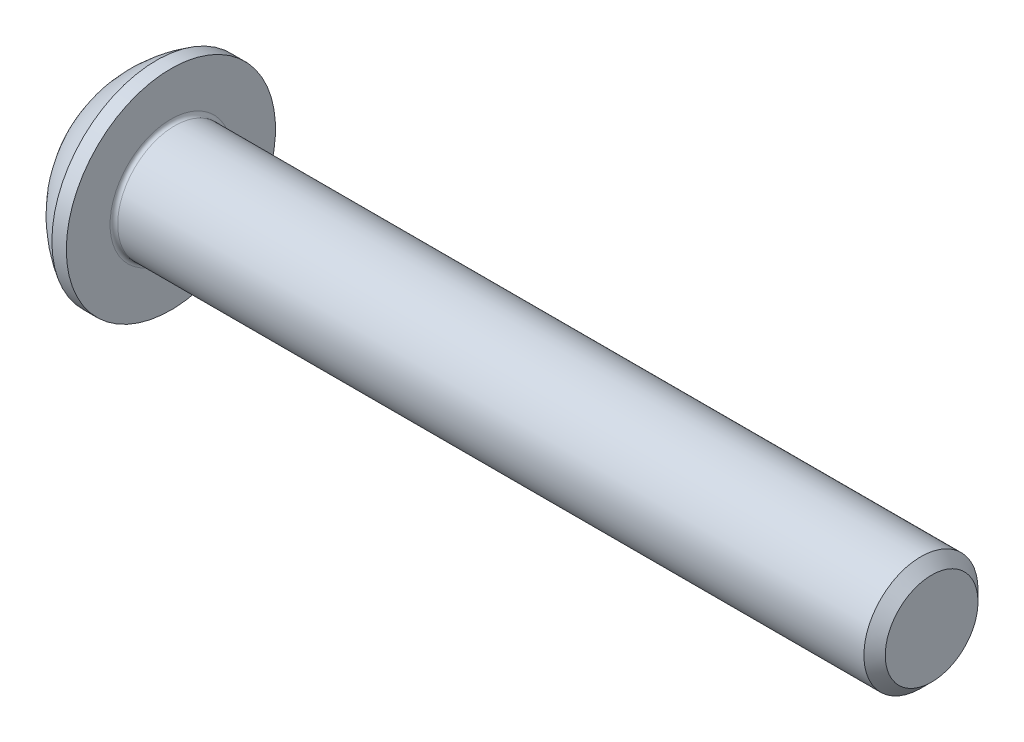
ISO-10303-21;
HEADER;
FILE_DESCRIPTION(('STEP AP214'),'2;1');
FILE_NAME('part.step','',(''),(''),'','','');
FILE_SCHEMA(('AUTOMOTIVE_DESIGN { 1 0 10303 214 1 1 1 1 }'));
ENDSEC;
DATA;
#1=APPLICATION_CONTEXT('core data for automotive mechanical design processes');
#2=APPLICATION_PROTOCOL_DEFINITION('international standard','automotive_design',2000,#1);
#3=PRODUCT_CONTEXT('',#1,'mechanical');
#4=PRODUCT('Part','Part','',(#3));
#5=PRODUCT_RELATED_PRODUCT_CATEGORY('part','',(#4));
#6=PRODUCT_DEFINITION_FORMATION('','',#4);
#7=PRODUCT_DEFINITION_CONTEXT('part definition',#1,'design');
#8=PRODUCT_DEFINITION('design','',#6,#7);
#9=PRODUCT_DEFINITION_SHAPE('','',#8);
#10=(LENGTH_UNIT() NAMED_UNIT(*) SI_UNIT(.MILLI.,.METRE.));
#11=(NAMED_UNIT(*) PLANE_ANGLE_UNIT() SI_UNIT($,.RADIAN.));
#12=(NAMED_UNIT(*) SI_UNIT($,.STERADIAN.) SOLID_ANGLE_UNIT());
#13=UNCERTAINTY_MEASURE_WITH_UNIT(LENGTH_MEASURE(1.E-05),#10,'distance_accuracy_value','');
#14=(GEOMETRIC_REPRESENTATION_CONTEXT(3) GLOBAL_UNCERTAINTY_ASSIGNED_CONTEXT((#13)) GLOBAL_UNIT_ASSIGNED_CONTEXT((#10,
#11,#12)) REPRESENTATION_CONTEXT('',''));
#15=CARTESIAN_POINT('',(0.,0.,0.));
#16=DIRECTION('',(0.,0.,1.));
#17=DIRECTION('',(1.,0.,0.));
#18=AXIS2_PLACEMENT_3D('',#15,#16,#17);
#19=CARTESIAN_POINT('',(1.04,0.,0.));
#20=DIRECTION('',(-1.,0.,0.));
#21=DIRECTION('',(0.,0.,1.));
#22=AXIS2_PLACEMENT_3D('',#19,#20,#21);
#23=PLANE('',#22);
#24=DIRECTION('',(0.,-1.,0.));
#25=VECTOR('',#24,1.);
#26=CARTESIAN_POINT('',(1.04,0.577350269189628,-1.));
#27=LINE('',#26,#25);
#28=CARTESIAN_POINT('',(1.04,0.577350269189628,-1.));
#29=VERTEX_POINT('',#28);
#30=CARTESIAN_POINT('',(1.04,0.,-1.));
#31=VERTEX_POINT('',#30);
#32=EDGE_CURVE('E254',#29,#31,#27,.T.);
#33=ORIENTED_EDGE('',*,*,#32,.T.);
#34=CARTESIAN_POINT('',(1.04,0.,0.));
#35=DIRECTION('',(1.,0.,0.));
#36=DIRECTION('',(0.,0.,-1.));
#37=AXIS2_PLACEMENT_3D('',#34,#35,#36);
#38=CIRCLE('',#37,0.999999999983859);
#39=CARTESIAN_POINT('',(1.04,0.866025403770461,-0.499999999991928));
#40=VERTEX_POINT('',#39);
#41=EDGE_CURVE('E50',#31,#40,#38,.T.);
#42=ORIENTED_EDGE('',*,*,#41,.T.);
#43=DIRECTION('',(0.,-0.499999999999999,-0.866025403784439));
#44=VECTOR('',#43,1.);
#45=CARTESIAN_POINT('',(1.04,1.15470053837925,0.));
#46=LINE('',#45,#44);
#47=EDGE_CURVE('E225',#40,#29,#46,.T.);
#48=ORIENTED_EDGE('',*,*,#47,.T.);
#49=EDGE_LOOP('',(#33,#42,#48));
#50=FACE_BOUND('',#49,.T.);
#51=ADVANCED_FACE('F35',(#50),#23,.T.);
#52=CARTESIAN_POINT('',(1.04,1.15470053837925,0.));
#53=VERTEX_POINT('',#52);
#54=EDGE_CURVE('E257',#53,#40,#46,.T.);
#55=ORIENTED_EDGE('',*,*,#54,.T.);
#56=CARTESIAN_POINT('',(1.04,0.866025403770461,0.499999999991928));
#57=VERTEX_POINT('',#56);
#58=EDGE_CURVE('E189',#40,#57,#38,.T.);
#59=ORIENTED_EDGE('',*,*,#58,.T.);
#60=DIRECTION('',(0.,0.499999999999999,-0.866025403784439));
#61=VECTOR('',#60,1.);
#62=CARTESIAN_POINT('',(1.04,0.577350269189628,1.));
#63=LINE('',#62,#61);
#64=EDGE_CURVE('E241',#57,#53,#63,.T.);
#65=ORIENTED_EDGE('',*,*,#64,.T.);
#66=EDGE_LOOP('',(#55,#59,#65));
#67=FACE_BOUND('',#66,.T.);
#68=ADVANCED_FACE('F125',(#67),#23,.T.);
#69=CARTESIAN_POINT('',(1.04,0.577350269189628,1.));
#70=VERTEX_POINT('',#69);
#71=EDGE_CURVE('E213',#70,#57,#63,.T.);
#72=ORIENTED_EDGE('',*,*,#71,.T.);
#73=CARTESIAN_POINT('',(1.04,0.,0.999999999983859));
#74=VERTEX_POINT('',#73);
#75=EDGE_CURVE('E193',#57,#74,#38,.T.);
#76=ORIENTED_EDGE('',*,*,#75,.T.);
#77=DIRECTION('',(0.,1.,0.));
#78=VECTOR('',#77,1.);
#79=CARTESIAN_POINT('',(1.04,-0.577350269189625,1.));
#80=LINE('',#79,#78);
#81=EDGE_CURVE('E245',#74,#70,#80,.T.);
#82=ORIENTED_EDGE('',*,*,#81,.T.);
#83=EDGE_LOOP('',(#72,#76,#82));
#84=FACE_BOUND('',#83,.T.);
#85=ADVANCED_FACE('F130',(#84),#23,.T.);
#86=CARTESIAN_POINT('',(1.04,-0.577350269189625,1.));
#87=VERTEX_POINT('',#86);
#88=EDGE_CURVE('E242',#87,#74,#80,.T.);
#89=ORIENTED_EDGE('',*,*,#88,.T.);
#90=CARTESIAN_POINT('',(1.04,-0.866025403770461,0.499999999991928));
#91=VERTEX_POINT('',#90);
#92=EDGE_CURVE('E263',#74,#91,#38,.T.);
#93=ORIENTED_EDGE('',*,*,#92,.T.);
#94=DIRECTION('',(0.,0.499999999999998,0.86602540378444));
#95=VECTOR('',#94,1.);
#96=CARTESIAN_POINT('',(1.04,-1.15470053837925,0.));
#97=LINE('',#96,#95);
#98=EDGE_CURVE('E249',#91,#87,#97,.T.);
#99=ORIENTED_EDGE('',*,*,#98,.T.);
#100=EDGE_LOOP('',(#89,#93,#99));
#101=FACE_BOUND('',#100,.T.);
#102=ADVANCED_FACE('F275',(#101),#23,.T.);
#103=CARTESIAN_POINT('',(1.04,-1.15470053837925,0.));
#104=VERTEX_POINT('',#103);
#105=EDGE_CURVE('E246',#104,#91,#97,.T.);
#106=ORIENTED_EDGE('',*,*,#105,.T.);
#107=CARTESIAN_POINT('',(1.04,-0.866025403770461,-0.499999999991927));
#108=VERTEX_POINT('',#107);
#109=EDGE_CURVE('E260',#91,#108,#38,.T.);
#110=ORIENTED_EDGE('',*,*,#109,.T.);
#111=DIRECTION('',(0.,-0.499999999999998,0.86602540378444));
#112=VECTOR('',#111,1.);
#113=CARTESIAN_POINT('',(1.04,-0.577350269189626,-1.));
#114=LINE('',#113,#112);
#115=EDGE_CURVE('E253',#108,#104,#114,.T.);
#116=ORIENTED_EDGE('',*,*,#115,.T.);
#117=EDGE_LOOP('',(#106,#110,#116));
#118=FACE_BOUND('',#117,.T.);
#119=ADVANCED_FACE('F123',(#118),#23,.T.);
#120=CARTESIAN_POINT('',(1.65,0.,0.));
#121=DIRECTION('',(-1.,0.,0.));
#122=DIRECTION('',(0.,0.,1.));
#123=AXIS2_PLACEMENT_3D('',#120,#121,#122);
#124=CYLINDRICAL_SURFACE('',#123,2.75);
#125=CARTESIAN_POINT('',(1.65,0.,0.));
#126=DIRECTION('',(-1.,0.,0.));
#127=DIRECTION('',(0.,0.,1.));
#128=AXIS2_PLACEMENT_3D('',#125,#126,#127);
#129=CIRCLE('',#128,2.75);
#130=CARTESIAN_POINT('',(1.65,0.,2.75));
#131=VERTEX_POINT('',#130);
#132=EDGE_CURVE('E196',#131,#131,#129,.T.);
#133=ORIENTED_EDGE('',*,*,#132,.T.);
#134=EDGE_LOOP('',(#133));
#135=FACE_BOUND('',#134,.T.);
#136=CARTESIAN_POINT('',(1.27,0.,0.));
#137=DIRECTION('',(-1.,0.,0.));
#138=DIRECTION('',(0.,0.,1.));
#139=AXIS2_PLACEMENT_3D('',#136,#137,#138);
#140=CIRCLE('',#139,2.75);
#141=CARTESIAN_POINT('',(1.27,0.,2.75));
#142=VERTEX_POINT('',#141);
#143=EDGE_CURVE('E206',#142,#142,#140,.T.);
#144=ORIENTED_EDGE('',*,*,#143,.F.);
#145=EDGE_LOOP('',(#144));
#146=FACE_BOUND('',#145,.T.);
#147=ADVANCED_FACE('F167',(#135,#146),#124,.T.);
#148=CARTESIAN_POINT('',(1.65,2.75,0.));
#149=DIRECTION('',(1.,0.,0.));
#150=DIRECTION('',(0.,0.,-1.));
#151=AXIS2_PLACEMENT_3D('',#148,#149,#150);
#152=PLANE('',#151);
#153=CARTESIAN_POINT('',(1.65,0.,0.));
#154=DIRECTION('',(1.,0.,0.));
#155=DIRECTION('',(0.,0.,-1.));
#156=AXIS2_PLACEMENT_3D('',#153,#154,#155);
#157=CIRCLE('',#156,1.6);
#158=CARTESIAN_POINT('',(1.65,0.,-1.6));
#159=VERTEX_POINT('',#158);
#160=EDGE_CURVE('E184',#159,#159,#157,.F.);
#161=ORIENTED_EDGE('',*,*,#160,.T.);
#162=EDGE_LOOP('',(#161));
#163=FACE_BOUND('',#162,.T.);
#164=ORIENTED_EDGE('',*,*,#132,.F.);
#165=EDGE_LOOP('',(#164));
#166=FACE_BOUND('',#165,.T.);
#167=ADVANCED_FACE('F163',(#163,#166),#152,.T.);
#168=CARTESIAN_POINT('',(0.,0.,0.));
#169=DIRECTION('',(-1.,0.,0.));
#170=DIRECTION('',(0.,0.,1.));
#171=AXIS2_PLACEMENT_3D('',#168,#169,#170);
#172=PLANE('',#171);
#173=DIRECTION('',(0.,-0.499999999999999,-0.866025403784439));
#174=VECTOR('',#173,1.);
#175=CARTESIAN_POINT('',(0.,1.15470053837925,0.));
#176=LINE('',#175,#174);
#177=CARTESIAN_POINT('',(0.,1.15470053837925,0.));
#178=VERTEX_POINT('',#177);
#179=CARTESIAN_POINT('',(0.,0.577350269189628,-1.));
#180=VERTEX_POINT('',#179);
#181=EDGE_CURVE('E58',#178,#180,#176,.T.);
#182=ORIENTED_EDGE('',*,*,#181,.F.);
#183=DIRECTION('',(0.,0.499999999999999,-0.866025403784439));
#184=VECTOR('',#183,1.);
#185=CARTESIAN_POINT('',(0.,0.577350269189628,1.));
#186=LINE('',#185,#184);
#187=CARTESIAN_POINT('',(0.,0.577350269189628,1.));
#188=VERTEX_POINT('',#187);
#189=EDGE_CURVE('E222',#188,#178,#186,.T.);
#190=ORIENTED_EDGE('',*,*,#189,.F.);
#191=DIRECTION('',(0.,1.,0.));
#192=VECTOR('',#191,1.);
#193=CARTESIAN_POINT('',(0.,-0.577350269189625,1.));
#194=LINE('',#193,#192);
#195=CARTESIAN_POINT('',(0.,-0.577350269189625,1.));
#196=VERTEX_POINT('',#195);
#197=EDGE_CURVE('E226',#196,#188,#194,.T.);
#198=ORIENTED_EDGE('',*,*,#197,.F.);
#199=DIRECTION('',(0.,0.499999999999998,0.86602540378444));
#200=VECTOR('',#199,1.);
#201=CARTESIAN_POINT('',(0.,-1.15470053837925,0.));
#202=LINE('',#201,#200);
#203=CARTESIAN_POINT('',(0.,-1.15470053837925,0.));
#204=VERTEX_POINT('',#203);
#205=EDGE_CURVE('E229',#204,#196,#202,.T.);
#206=ORIENTED_EDGE('',*,*,#205,.F.);
#207=DIRECTION('',(0.,-0.499999999999998,0.86602540378444));
#208=VECTOR('',#207,1.);
#209=CARTESIAN_POINT('',(0.,-0.577350269189626,-1.));
#210=LINE('',#209,#208);
#211=CARTESIAN_POINT('',(0.,-0.577350269189626,-1.));
#212=VERTEX_POINT('',#211);
#213=EDGE_CURVE('E232',#212,#204,#210,.T.);
#214=ORIENTED_EDGE('',*,*,#213,.F.);
#215=DIRECTION('',(0.,-1.,0.));
#216=VECTOR('',#215,1.);
#217=CARTESIAN_POINT('',(0.,0.577350269189628,-1.));
#218=LINE('',#217,#216);
#219=EDGE_CURVE('E235',#180,#212,#218,.T.);
#220=ORIENTED_EDGE('',*,*,#219,.F.);
#221=EDGE_LOOP('',(#182,#190,#198,#206,#214,#220));
#222=FACE_BOUND('',#221,.T.);
#223=CARTESIAN_POINT('',(0.,0.,0.));
#224=DIRECTION('',(-1.,0.,0.));
#225=DIRECTION('',(0.,0.,1.));
#226=AXIS2_PLACEMENT_3D('',#223,#224,#225);
#227=CIRCLE('',#226,1.425);
#228=CARTESIAN_POINT('',(0.,0.,1.425));
#229=VERTEX_POINT('',#228);
#230=EDGE_CURVE('E203',#229,#229,#227,.T.);
#231=ORIENTED_EDGE('',*,*,#230,.T.);
#232=EDGE_LOOP('',(#231));
#233=FACE_BOUND('',#232,.T.);
#234=ADVANCED_FACE('F159',(#222,#233),#172,.T.);
#235=CARTESIAN_POINT('',(2.96202427690375,0.,0.));
#236=DIRECTION('',(-1.,0.,0.));
#237=DIRECTION('',(0.,0.,1.));
#238=AXIS2_PLACEMENT_3D('',#235,#236,#237);
#239=DEGENERATE_TOROIDAL_SURFACE('',#238,0.14293081635303,3.35141684393879,.F.);
#240=ORIENTED_EDGE('',*,*,#143,.T.);
#241=EDGE_LOOP('',(#240));
#242=FACE_BOUND('',#241,.T.);
#243=ORIENTED_EDGE('',*,*,#230,.F.);
#244=EDGE_LOOP('',(#243));
#245=FACE_BOUND('',#244,.T.);
#246=ADVANCED_FACE('F156',(#242,#245),#239,.F.);
#247=CARTESIAN_POINT('',(1.04,1.15470053837925,0.));
#248=DIRECTION('',(0.,0.866025403784439,-0.499999999999999));
#249=DIRECTION('',(0.,0.499999999999999,0.866025403784439));
#250=AXIS2_PLACEMENT_3D('',#247,#248,#249);
#251=PLANE('',#250);
#252=ORIENTED_EDGE('',*,*,#181,.T.);
#253=DIRECTION('',(-1.,0.,0.));
#254=VECTOR('',#253,1.);
#255=CARTESIAN_POINT('',(1.04,0.577350269189628,-1.));
#256=LINE('',#255,#254);
#257=EDGE_CURVE('E210',#29,#180,#256,.T.);
#258=ORIENTED_EDGE('',*,*,#257,.F.);
#259=ORIENTED_EDGE('',*,*,#47,.F.);
#260=ORIENTED_EDGE('',*,*,#54,.F.);
#261=DIRECTION('',(-1.,0.,0.));
#262=VECTOR('',#261,1.);
#263=CARTESIAN_POINT('',(1.04,1.15470053837925,0.));
#264=LINE('',#263,#262);
#265=EDGE_CURVE('E209',#53,#178,#264,.T.);
#266=ORIENTED_EDGE('',*,*,#265,.T.);
#267=EDGE_LOOP('',(#252,#258,#259,#260,#266));
#268=FACE_BOUND('',#267,.T.);
#269=ADVANCED_FACE('F138',(#268),#251,.F.);
#270=CARTESIAN_POINT('',(1.04,0.577350269189628,1.));
#271=DIRECTION('',(0.,0.866025403784439,0.499999999999999));
#272=DIRECTION('',(0.,-0.499999999999999,0.866025403784439));
#273=AXIS2_PLACEMENT_3D('',#270,#271,#272);
#274=PLANE('',#273);
#275=ORIENTED_EDGE('',*,*,#189,.T.);
#276=ORIENTED_EDGE('',*,*,#265,.F.);
#277=ORIENTED_EDGE('',*,*,#64,.F.);
#278=ORIENTED_EDGE('',*,*,#71,.F.);
#279=DIRECTION('',(-1.,0.,0.));
#280=VECTOR('',#279,1.);
#281=CARTESIAN_POINT('',(1.04,0.577350269189628,1.));
#282=LINE('',#281,#280);
#283=EDGE_CURVE('E219',#70,#188,#282,.T.);
#284=ORIENTED_EDGE('',*,*,#283,.T.);
#285=EDGE_LOOP('',(#275,#276,#277,#278,#284));
#286=FACE_BOUND('',#285,.T.);
#287=ADVANCED_FACE('F134',(#286),#274,.F.);
#288=CARTESIAN_POINT('',(1.04,-0.577350269189625,1.));
#289=DIRECTION('',(0.,0.,1.));
#290=DIRECTION('',(1.,0.,0.));
#291=AXIS2_PLACEMENT_3D('',#288,#289,#290);
#292=PLANE('',#291);
#293=ORIENTED_EDGE('',*,*,#197,.T.);
#294=ORIENTED_EDGE('',*,*,#283,.F.);
#295=ORIENTED_EDGE('',*,*,#81,.F.);
#296=ORIENTED_EDGE('',*,*,#88,.F.);
#297=DIRECTION('',(-1.,0.,0.));
#298=VECTOR('',#297,1.);
#299=CARTESIAN_POINT('',(1.04,-0.577350269189625,1.));
#300=LINE('',#299,#298);
#301=EDGE_CURVE('E217',#87,#196,#300,.T.);
#302=ORIENTED_EDGE('',*,*,#301,.T.);
#303=EDGE_LOOP('',(#293,#294,#295,#296,#302));
#304=FACE_BOUND('',#303,.T.);
#305=ADVANCED_FACE('F137',(#304),#292,.F.);
#306=CARTESIAN_POINT('',(1.04,-1.15470053837925,0.));
#307=DIRECTION('',(0.,-0.86602540378444,0.499999999999998));
#308=DIRECTION('',(0.,-0.499999999999998,-0.86602540378444));
#309=AXIS2_PLACEMENT_3D('',#306,#307,#308);
#310=PLANE('',#309);
#311=ORIENTED_EDGE('',*,*,#205,.T.);
#312=ORIENTED_EDGE('',*,*,#301,.F.);
#313=ORIENTED_EDGE('',*,*,#98,.F.);
#314=ORIENTED_EDGE('',*,*,#105,.F.);
#315=DIRECTION('',(-1.,0.,0.));
#316=VECTOR('',#315,1.);
#317=CARTESIAN_POINT('',(1.04,-1.15470053837925,0.));
#318=LINE('',#317,#316);
#319=EDGE_CURVE('E215',#104,#204,#318,.T.);
#320=ORIENTED_EDGE('',*,*,#319,.T.);
#321=EDGE_LOOP('',(#311,#312,#313,#314,#320));
#322=FACE_BOUND('',#321,.T.);
#323=ADVANCED_FACE('F142',(#322),#310,.F.);
#324=CARTESIAN_POINT('',(1.04,-0.577350269189626,-1.));
#325=DIRECTION('',(0.,-0.86602540378444,-0.499999999999998));
#326=DIRECTION('',(0.,0.499999999999998,-0.86602540378444));
#327=AXIS2_PLACEMENT_3D('',#324,#325,#326);
#328=PLANE('',#327);
#329=ORIENTED_EDGE('',*,*,#213,.T.);
#330=ORIENTED_EDGE('',*,*,#319,.F.);
#331=ORIENTED_EDGE('',*,*,#115,.F.);
#332=CARTESIAN_POINT('',(1.04,-0.577350269189626,-1.));
#333=VERTEX_POINT('',#332);
#334=EDGE_CURVE('E250',#333,#108,#114,.T.);
#335=ORIENTED_EDGE('',*,*,#334,.F.);
#336=DIRECTION('',(-1.,0.,0.));
#337=VECTOR('',#336,1.);
#338=CARTESIAN_POINT('',(1.04,-0.577350269189626,-1.));
#339=LINE('',#338,#337);
#340=EDGE_CURVE('E212',#333,#212,#339,.T.);
#341=ORIENTED_EDGE('',*,*,#340,.T.);
#342=EDGE_LOOP('',(#329,#330,#331,#335,#341));
#343=FACE_BOUND('',#342,.T.);
#344=ADVANCED_FACE('F146',(#343),#328,.F.);
#345=CARTESIAN_POINT('',(1.04,0.577350269189628,-1.));
#346=DIRECTION('',(0.,0.,-1.));
#347=DIRECTION('',(-1.,0.,0.));
#348=AXIS2_PLACEMENT_3D('',#345,#346,#347);
#349=PLANE('',#348);
#350=ORIENTED_EDGE('',*,*,#219,.T.);
#351=ORIENTED_EDGE('',*,*,#340,.F.);
#352=EDGE_CURVE('E256',#31,#333,#27,.T.);
#353=ORIENTED_EDGE('',*,*,#352,.F.);
#354=ORIENTED_EDGE('',*,*,#32,.F.);
#355=ORIENTED_EDGE('',*,*,#257,.T.);
#356=EDGE_LOOP('',(#350,#351,#353,#354,#355));
#357=FACE_BOUND('',#356,.T.);
#358=ADVANCED_FACE('F120',(#357),#349,.F.);
#359=ORIENTED_EDGE('',*,*,#334,.T.);
#360=EDGE_CURVE('E202',#108,#31,#38,.T.);
#361=ORIENTED_EDGE('',*,*,#360,.T.);
#362=ORIENTED_EDGE('',*,*,#352,.T.);
#363=EDGE_LOOP('',(#359,#361,#362));
#364=FACE_BOUND('',#363,.T.);
#365=ADVANCED_FACE('F111',(#364),#23,.T.);
#366=CARTESIAN_POINT('',(1.61735026918031,0.,0.));
#367=DIRECTION('',(-1.,0.,0.));
#368=DIRECTION('',(0.,0.,1.));
#369=AXIS2_PLACEMENT_3D('',#366,#367,#368);
#370=CONICAL_SURFACE('',#369,0.,1.0471975511966);
#371=ORIENTED_EDGE('',*,*,#41,.F.);
#372=ORIENTED_EDGE('',*,*,#360,.F.);
#373=ORIENTED_EDGE('',*,*,#109,.F.);
#374=ORIENTED_EDGE('',*,*,#92,.F.);
#375=ORIENTED_EDGE('',*,*,#75,.F.);
#376=ORIENTED_EDGE('',*,*,#58,.F.);
#377=EDGE_LOOP('',(#371,#372,#373,#374,#375,#376));
#378=FACE_BOUND('',#377,.T.);
#379=CARTESIAN_POINT('',(1.61735026918031,0.,0.));
#380=VERTEX_POINT('',#379);
#381=VERTEX_LOOP('',#380);
#382=FACE_BOUND('',#381,.T.);
#383=ADVANCED_FACE('F108',(#378,#382),#370,.F.);
#384=CARTESIAN_POINT('',(21.65,0.,0.));
#385=DIRECTION('',(-1.,0.,0.));
#386=DIRECTION('',(0.,0.,1.));
#387=AXIS2_PLACEMENT_3D('',#384,#385,#386);
#388=CYLINDRICAL_SURFACE('',#387,1.5);
#389=CARTESIAN_POINT('',(21.3695,0.,0.));
#390=DIRECTION('',(1.,0.,0.));
#391=DIRECTION('',(0.,0.,-1.));
#392=AXIS2_PLACEMENT_3D('',#389,#390,#391);
#393=CIRCLE('',#392,1.5);
#394=CARTESIAN_POINT('',(21.3695,0.,-1.5));
#395=VERTEX_POINT('',#394);
#396=EDGE_CURVE('E11',#395,#395,#393,.F.);
#397=ORIENTED_EDGE('',*,*,#396,.T.);
#398=EDGE_LOOP('',(#397));
#399=FACE_BOUND('',#398,.T.);
#400=CARTESIAN_POINT('',(1.75,0.,0.));
#401=DIRECTION('',(1.,0.,0.));
#402=DIRECTION('',(0.,0.,-1.));
#403=AXIS2_PLACEMENT_3D('',#400,#401,#402);
#404=CIRCLE('',#403,1.5);
#405=CARTESIAN_POINT('',(1.75,0.,-1.5));
#406=VERTEX_POINT('',#405);
#407=EDGE_CURVE('E187',#406,#406,#404,.T.);
#408=ORIENTED_EDGE('',*,*,#407,.T.);
#409=EDGE_LOOP('',(#408));
#410=FACE_BOUND('',#409,.T.);
#411=ADVANCED_FACE('F110',(#399,#410),#388,.T.);
#412=CARTESIAN_POINT('',(21.65,0.,0.));
#413=DIRECTION('',(1.,0.,0.));
#414=DIRECTION('',(0.,0.,-1.));
#415=AXIS2_PLACEMENT_3D('',#412,#413,#414);
#416=PLANE('',#415);
#417=CARTESIAN_POINT('',(21.65,0.,0.));
#418=DIRECTION('',(1.,0.,0.));
#419=DIRECTION('',(0.,0.,-1.));
#420=AXIS2_PLACEMENT_3D('',#417,#418,#419);
#421=CIRCLE('',#420,1.2195);
#422=CARTESIAN_POINT('',(21.65,0.,-1.2195));
#423=VERTEX_POINT('',#422);
#424=EDGE_CURVE('E43',#423,#423,#421,.T.);
#425=ORIENTED_EDGE('',*,*,#424,.T.);
#426=EDGE_LOOP('',(#425));
#427=FACE_BOUND('',#426,.T.);
#428=ADVANCED_FACE('F117',(#427),#416,.T.);
#429=CARTESIAN_POINT('',(1.75,0.,0.));
#430=DIRECTION('',(1.,0.,0.));
#431=DIRECTION('',(0.,0.,-1.));
#432=AXIS2_PLACEMENT_3D('',#429,#430,#431);
#433=TOROIDAL_SURFACE('',#432,1.6,0.1);
#434=ORIENTED_EDGE('',*,*,#160,.F.);
#435=EDGE_LOOP('',(#434));
#436=FACE_BOUND('',#435,.T.);
#437=ORIENTED_EDGE('',*,*,#407,.F.);
#438=EDGE_LOOP('',(#437));
#439=FACE_BOUND('',#438,.T.);
#440=ADVANCED_FACE('F171',(#436,#439),#433,.F.);
#441=CARTESIAN_POINT('',(21.65,0.,0.));
#442=DIRECTION('',(-1.,0.,0.));
#443=DIRECTION('',(0.,0.,1.));
#444=AXIS2_PLACEMENT_3D('',#441,#442,#443);
#445=CONICAL_SURFACE('',#444,1.2195,0.785398163397446);
#446=ORIENTED_EDGE('',*,*,#396,.F.);
#447=EDGE_LOOP('',(#446));
#448=FACE_BOUND('',#447,.T.);
#449=ORIENTED_EDGE('',*,*,#424,.F.);
#450=EDGE_LOOP('',(#449));
#451=FACE_BOUND('',#450,.T.);
#452=ADVANCED_FACE('F37',(#448,#451),#445,.T.);
#453=CLOSED_SHELL('',(#51,#68,#85,#102,#119,#147,#167,#234,#246,#269,#287,#305,#323,#344,#358,
#365,#383,#411,#428,#440,#452));
#454=MANIFOLD_SOLID_BREP('B2',#453);
#455=ADVANCED_BREP_SHAPE_REPRESENTATION('',(#18,#454),#14);
#456=SHAPE_DEFINITION_REPRESENTATION(#9,#455);
ENDSEC;
END-ISO-10303-21;
